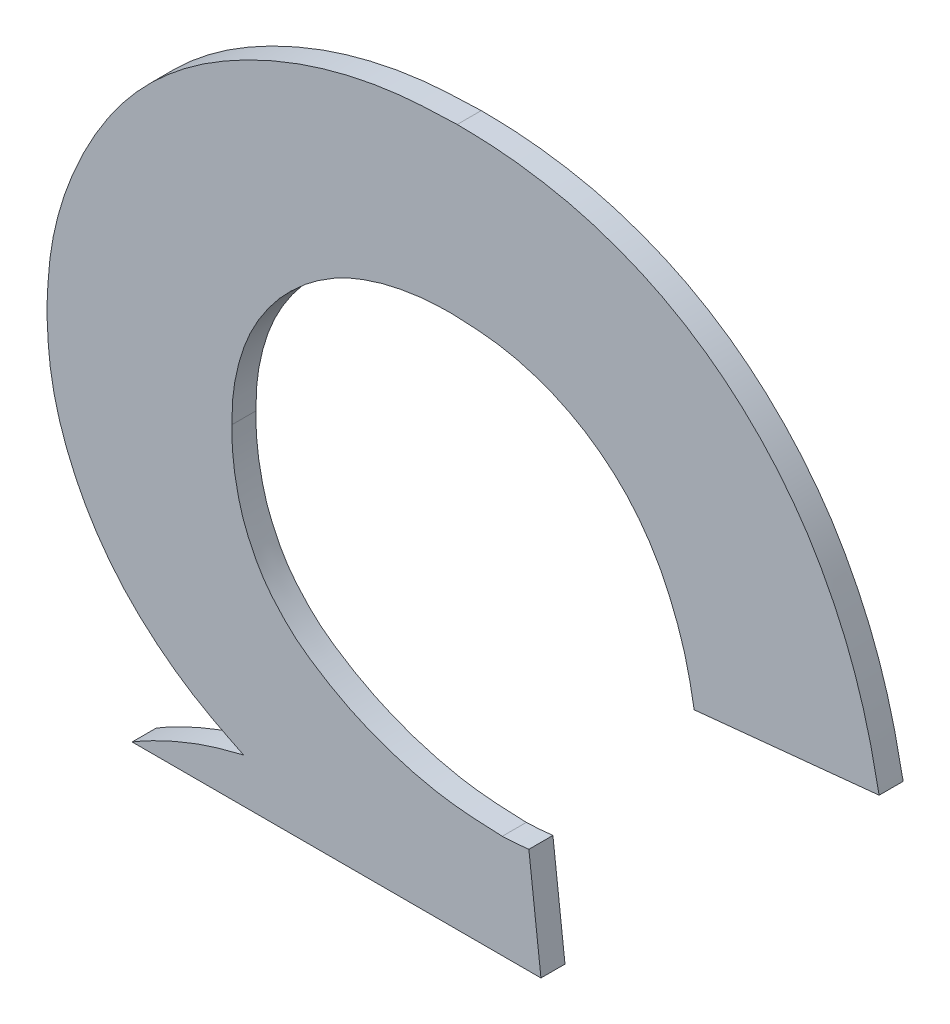
ISO-10303-21;
HEADER;
FILE_DESCRIPTION(('STEP AP214'),'2;1');
FILE_NAME('part.step','',(''),(''),'','','');
FILE_SCHEMA(('AUTOMOTIVE_DESIGN { 1 0 10303 214 1 1 1 1 }'));
ENDSEC;
DATA;
#1=APPLICATION_CONTEXT('core data for automotive mechanical design processes');
#2=APPLICATION_PROTOCOL_DEFINITION('international standard','automotive_design',2000,#1);
#3=PRODUCT_CONTEXT('',#1,'mechanical');
#4=PRODUCT('Part','Part','',(#3));
#5=PRODUCT_RELATED_PRODUCT_CATEGORY('part','',(#4));
#6=PRODUCT_DEFINITION_FORMATION('','',#4);
#7=PRODUCT_DEFINITION_CONTEXT('part definition',#1,'design');
#8=PRODUCT_DEFINITION('design','',#6,#7);
#9=PRODUCT_DEFINITION_SHAPE('','',#8);
#10=(LENGTH_UNIT() NAMED_UNIT(*) SI_UNIT(.MILLI.,.METRE.));
#11=(NAMED_UNIT(*) PLANE_ANGLE_UNIT() SI_UNIT($,.RADIAN.));
#12=(NAMED_UNIT(*) SI_UNIT($,.STERADIAN.) SOLID_ANGLE_UNIT());
#13=UNCERTAINTY_MEASURE_WITH_UNIT(LENGTH_MEASURE(1.E-05),#10,'distance_accuracy_value','');
#14=(GEOMETRIC_REPRESENTATION_CONTEXT(3) GLOBAL_UNCERTAINTY_ASSIGNED_CONTEXT((#13)) GLOBAL_UNIT_ASSIGNED_CONTEXT((#10,
#11,#12)) REPRESENTATION_CONTEXT('',''));
#15=CARTESIAN_POINT('',(0.,0.,0.));
#16=DIRECTION('',(0.,0.,1.));
#17=DIRECTION('',(1.,0.,0.));
#18=AXIS2_PLACEMENT_3D('',#15,#16,#17);
#19=CARTESIAN_POINT('',(2.34375000000002,-0.76923076923077,0.5));
#20=DIRECTION('',(-0.993499272973,-0.113838458361489,0.));
#21=DIRECTION('',(0.113838458361489,-0.993499272973,0.));
#22=AXIS2_PLACEMENT_3D('',#19,#20,#21);
#23=PLANE('',#22);
#24=DIRECTION('',(-0.113838458361489,0.993499272973,0.));
#25=VECTOR('',#24,1.);
#26=CARTESIAN_POINT('',(2.34375000000002,-0.76923076923077,0.5));
#27=LINE('',#26,#25);
#28=CARTESIAN_POINT('',(2.19831730769232,0.5,0.5));
#29=VERTEX_POINT('',#28);
#30=CARTESIAN_POINT('',(1.9471153846154,2.69230769230769,0.5));
#31=VERTEX_POINT('',#30);
#32=EDGE_CURVE('E335',#29,#31,#27,.T.);
#33=ORIENTED_EDGE('',*,*,#32,.F.);
#34=DIRECTION('',(0.,0.,-1.));
#35=VECTOR('',#34,1.);
#36=CARTESIAN_POINT('',(2.19831730769232,0.5,0.5));
#37=LINE('',#36,#35);
#38=CARTESIAN_POINT('',(2.19831730769232,0.5,0.));
#39=VERTEX_POINT('',#38);
#40=EDGE_CURVE('E53',#29,#39,#37,.T.);
#41=ORIENTED_EDGE('',*,*,#40,.T.);
#42=DIRECTION('',(-0.113838458361489,0.993499272973,0.));
#43=VECTOR('',#42,1.);
#44=CARTESIAN_POINT('',(2.34375000000002,-0.76923076923077,0.));
#45=LINE('',#44,#43);
#46=CARTESIAN_POINT('',(1.9471153846154,2.69230769230769,0.));
#47=VERTEX_POINT('',#46);
#48=EDGE_CURVE('E131',#39,#47,#45,.T.);
#49=ORIENTED_EDGE('',*,*,#48,.T.);
#50=DIRECTION('',(0.,0.,-1.));
#51=VECTOR('',#50,1.);
#52=CARTESIAN_POINT('',(1.9471153846154,2.69230769230769,0.5));
#53=LINE('',#52,#51);
#54=EDGE_CURVE('E260',#31,#47,#53,.T.);
#55=ORIENTED_EDGE('',*,*,#54,.F.);
#56=EDGE_LOOP('',(#33,#41,#49,#55));
#57=FACE_BOUND('',#56,.T.);
#58=ADVANCED_FACE('F39',(#57),#23,.F.);
#59=CARTESIAN_POINT('',(-3.98437499999998,1.42427884615384,0.5));
#60=CARTESIAN_POINT('',(-4.19980781435353,1.36988632262383,0.5));
#61=CARTESIAN_POINT('',(-4.62177781460573,1.26334724575874,0.5));
#62=CARTESIAN_POINT('',(-5.22782243598737,1.04260127920748,0.5));
#63=CARTESIAN_POINT('',(-5.79757241209382,0.784163298342848,0.5));
#64=CARTESIAN_POINT('',(-6.33861076027774,0.491451858864843,0.5));
#65=CARTESIAN_POINT('',(-6.83523011315003,0.145273143521969,0.5));
#66=CARTESIAN_POINT('',(-7.30454850547066,-0.233234039938428,0.5));
#67=CARTESIAN_POINT('',(-7.72882460582666,-0.662298857492223,0.5));
#68=CARTESIAN_POINT('',(-8.12035046471587,-1.1266286818268,0.5));
#69=CARTESIAN_POINT('',(-8.47659092188428,-1.6213642206543,0.5));
#70=CARTESIAN_POINT('',(-8.77637075945554,-2.15612918687906,0.5));
#71=CARTESIAN_POINT('',(-9.03507204743404,-2.71686556595007,0.5));
#72=CARTESIAN_POINT('',(-9.25566791173105,-3.30764034436966,0.5));
#73=CARTESIAN_POINT('',(-9.4141876024644,-3.93300884839882,0.5));
#74=CARTESIAN_POINT('',(-9.52753418707501,-4.58812633984064,0.5));
#75=CARTESIAN_POINT('',(-9.60233368970874,-5.27071672839264,0.5));
#76=CARTESIAN_POINT('',(-9.61099166837927,-5.73698113181403,0.5));
#77=CARTESIAN_POINT('',(-9.6153846153846,-5.97355769230769,0.5));
#78=B_SPLINE_CURVE_WITH_KNOTS('',3,(#59,#60,#61,#62,#63,#64,#65,#66,#67,#68,#69,#70,#71,#72,#73,
#74,#75,#76,#77),.UNSPECIFIED.,.F.,.F.,(4,1,1,1,1,1,1,1,1,1,1,1,1,1,1,1,4),(0.,
0.0658282446781898,0.128938316601441,0.190858323719115,0.251186231045244,0.310974017780072,
0.370049878512695,0.42967230953493,0.489507256826674,0.549975271732241,0.610074807611578,
0.670914865342259,0.732908854389039,0.796710708821786,0.861825383602173,0.92989197705194,1.),.UNSPECIFIED.);
#79=DIRECTION('',(0.,0.,-1.));
#80=VECTOR('',#79,1.);
#81=SURFACE_OF_LINEAR_EXTRUSION('',#78,#80);
#82=CARTESIAN_POINT('',(-3.98437499999998,1.42427884615384,0.));
#83=CARTESIAN_POINT('',(-4.19980781435353,1.36988632262383,0.));
#84=CARTESIAN_POINT('',(-4.62177781460573,1.26334724575874,0.));
#85=CARTESIAN_POINT('',(-5.22782243598737,1.04260127920748,0.));
#86=CARTESIAN_POINT('',(-5.79757241209382,0.784163298342848,0.));
#87=CARTESIAN_POINT('',(-6.33861076027774,0.491451858864843,0.));
#88=CARTESIAN_POINT('',(-6.83523011315003,0.145273143521969,0.));
#89=CARTESIAN_POINT('',(-7.30454850547066,-0.233234039938428,0.));
#90=CARTESIAN_POINT('',(-7.72882460582666,-0.662298857492223,0.));
#91=CARTESIAN_POINT('',(-8.12035046471587,-1.1266286818268,0.));
#92=CARTESIAN_POINT('',(-8.47659092188428,-1.6213642206543,0.));
#93=CARTESIAN_POINT('',(-8.77637075945554,-2.15612918687906,0.));
#94=CARTESIAN_POINT('',(-9.03507204743404,-2.71686556595007,0.));
#95=CARTESIAN_POINT('',(-9.25566791173105,-3.30764034436966,0.));
#96=CARTESIAN_POINT('',(-9.4141876024644,-3.93300884839882,0.));
#97=CARTESIAN_POINT('',(-9.52753418707501,-4.58812633984064,0.));
#98=CARTESIAN_POINT('',(-9.60233368970874,-5.27071672839264,0.));
#99=CARTESIAN_POINT('',(-9.61099166837927,-5.73698113181403,0.));
#100=CARTESIAN_POINT('',(-9.6153846153846,-5.97355769230769,0.));
#101=B_SPLINE_CURVE_WITH_KNOTS('',3,(#82,#83,#84,#85,#86,#87,#88,#89,#90,#91,#92,#93,#94,#95,
#96,#97,#98,#99,#100),.UNSPECIFIED.,.F.,.F.,(4,1,1,1,1,1,1,1,1,1,1,1,1,1,1,1,4),(0.,
0.0658282446781898,0.128938316601441,0.190858323719115,0.251186231045244,0.310974017780072,
0.370049878512695,0.42967230953493,0.489507256826674,0.549975271732241,0.610074807611578,
0.670914865342259,0.732908854389039,0.796710708821786,0.861825383602173,0.92989197705194,1.),.UNSPECIFIED.);
#102=CARTESIAN_POINT('',(-3.98437499999999,1.42427884615384,0.));
#103=VERTEX_POINT('',#102);
#104=CARTESIAN_POINT('',(-6.30271128193493,0.500000000000003,0.));
#105=VERTEX_POINT('',#104);
#106=EDGE_CURVE('E125',#103,#105,#101,.T.);
#107=ORIENTED_EDGE('',*,*,#106,.T.);
#108=DIRECTION('',(0.,0.,-1.));
#109=VECTOR('',#108,1.);
#110=CARTESIAN_POINT('',(-6.3027112837536,0.500000000000006,0.5));
#111=LINE('',#110,#109);
#112=CARTESIAN_POINT('',(-6.30271127647894,0.5,0.5));
#113=VERTEX_POINT('',#112);
#114=EDGE_CURVE('E113',#105,#113,#111,.F.);
#115=ORIENTED_EDGE('',*,*,#114,.T.);
#116=CARTESIAN_POINT('',(-3.98437499999999,1.42427884615384,0.5));
#117=VERTEX_POINT('',#116);
#118=EDGE_CURVE('E137',#117,#113,#78,.T.);
#119=ORIENTED_EDGE('',*,*,#118,.F.);
#120=DIRECTION('',(0.,0.,-1.));
#121=VECTOR('',#120,1.);
#122=CARTESIAN_POINT('',(-3.98437499999999,1.42427884615384,0.5));
#123=LINE('',#122,#121);
#124=EDGE_CURVE('E121',#117,#103,#123,.T.);
#125=ORIENTED_EDGE('',*,*,#124,.T.);
#126=EDGE_LOOP('',(#107,#115,#119,#125));
#127=FACE_BOUND('',#126,.T.);
#128=ADVANCED_FACE('F133',(#127),#81,.F.);
#129=CARTESIAN_POINT('',(6.6712729927265,-13.0558506104563,0.5));
#130=DIRECTION('',(0.,0.,-1.));
#131=DIRECTION('',(-1.,0.,0.));
#132=AXIS2_PLACEMENT_3D('',#129,#130,#131);
#133=PLANE('',#132);
#134=ORIENTED_EDGE('',*,*,#118,.T.);
#135=DIRECTION('',(1.,0.,0.));
#136=VECTOR('',#135,1.);
#137=CARTESIAN_POINT('',(6.6712729927265,0.5,0.5));
#138=LINE('',#137,#136);
#139=EDGE_CURVE('E120',#113,#29,#138,.T.);
#140=ORIENTED_EDGE('',*,*,#139,.T.);
#141=ORIENTED_EDGE('',*,*,#32,.T.);
#142=CARTESIAN_POINT('',(1.9471153846154,2.69230769230769,0.5));
#143=CARTESIAN_POINT('',(1.8430477377101,2.68093594163545,0.5));
#144=CARTESIAN_POINT('',(1.65919602781834,2.6608459725843,0.5));
#145=CARTESIAN_POINT('',(1.47441717432133,2.65344995245697,0.5));
#146=CARTESIAN_POINT('',(1.39423076923078,2.65024038461538,0.5));
#147=B_SPLINE_CURVE_WITH_KNOTS('',3,(#142,#143,#144,#145,#146),.UNSPECIFIED.,.F.,.F.,(4,1,4),
(0.,0.566041224020037,1.),.UNSPECIFIED.);
#148=CARTESIAN_POINT('',(1.39423076923078,2.65024038461538,0.5));
#149=VERTEX_POINT('',#148);
#150=EDGE_CURVE('E234',#31,#149,#147,.T.);
#151=ORIENTED_EDGE('',*,*,#150,.T.);
#152=CARTESIAN_POINT('',(1.39423076923078,2.65024038461538,0.5));
#153=CARTESIAN_POINT('',(1.04051198277855,2.66374523154057,0.5));
#154=CARTESIAN_POINT('',(0.346626907498309,2.69023749625548,0.5));
#155=CARTESIAN_POINT('',(-0.664923019283656,2.91036602840606,0.5));
#156=CARTESIAN_POINT('',(-1.62357567218962,3.25695129504603,0.5));
#157=CARTESIAN_POINT('',(-2.36419677269751,3.67047780300976,0.5));
#158=CARTESIAN_POINT('',(-2.91341635642348,4.05942194380833,0.5));
#159=CARTESIAN_POINT('',(-3.25974318354604,4.41011025876403,0.5));
#160=CARTESIAN_POINT('',(-3.57197468340025,4.7822614051555,0.5));
#161=CARTESIAN_POINT('',(-3.80492490181777,5.2091322486373,0.5));
#162=CARTESIAN_POINT('',(-4.00617951851744,5.6626928276327,0.5));
#163=CARTESIAN_POINT('',(-4.13080598641055,6.16081010329336,0.5));
#164=CARTESIAN_POINT('',(-4.22169379763049,6.69137613344254,0.5));
#165=CARTESIAN_POINT('',(-4.22768977117626,7.05886058040911,0.5));
#166=CARTESIAN_POINT('',(-4.23076923076921,7.24759615384615,0.5));
#167=B_SPLINE_CURVE_WITH_KNOTS('',3,(#152,#153,#154,#155,#156,#157,#158,#159,#160,#161,#162,
#163,#164,#165,#166),.UNSPECIFIED.,.F.,.F.,(4,1,1,1,1,1,1,1,1,1,1,1,4),(0.,0.129789075657632,
0.25460537009224,0.378435492481737,0.502919582675044,0.56501796697597,0.624847774630795,
0.683448087190674,0.74276451975577,0.802756957812947,0.865220374248951,0.930778812100126,1.),.UNSPECIFIED.);
#168=CARTESIAN_POINT('',(-4.23076923076921,7.24759615384615,0.5));
#169=VERTEX_POINT('',#168);
#170=EDGE_CURVE('E230',#149,#169,#167,.T.);
#171=ORIENTED_EDGE('',*,*,#170,.T.);
#172=CARTESIAN_POINT('',(-4.23076923076921,7.24759615384615,0.5));
#173=CARTESIAN_POINT('',(-4.22792711518039,7.40004424009474,0.5));
#174=CARTESIAN_POINT('',(-4.22236873883271,7.69818969209017,0.5));
#175=CARTESIAN_POINT('',(-4.16044592639652,8.13530240363856,0.5));
#176=CARTESIAN_POINT('',(-4.05803319884192,8.54948015916899,0.5));
#177=CARTESIAN_POINT('',(-3.91961221111562,8.94514523872855,0.5));
#178=CARTESIAN_POINT('',(-3.73819775873826,9.3202240205715,0.5));
#179=CARTESIAN_POINT('',(-3.51322959963469,9.67425733540094,0.5));
#180=CARTESIAN_POINT('',(-3.25619584096005,10.014427031895,0.5));
#181=CARTESIAN_POINT('',(-2.9527765864727,10.3231553655619,0.5));
#182=CARTESIAN_POINT('',(-2.62784089009125,10.6130054225936,0.5));
#183=CARTESIAN_POINT('',(-2.26953967652406,10.8571186146477,0.5));
#184=CARTESIAN_POINT('',(-1.89492541735422,11.0739773001811,0.5));
#185=CARTESIAN_POINT('',(-1.49078630367999,11.2378472872967,0.5));
#186=CARTESIAN_POINT('',(-1.06709959220831,11.3725751341235,0.5));
#187=CARTESIAN_POINT('',(-0.620243546719225,11.4669869527826,0.5));
#188=CARTESIAN_POINT('',(-0.150055070650286,11.5303908192876,0.5));
#189=CARTESIAN_POINT('',(0.172057838686011,11.535733436198,0.5));
#190=CARTESIAN_POINT('',(0.336538461538478,11.5384615384615,0.5));
#191=B_SPLINE_CURVE_WITH_KNOTS('',3,(#172,#173,#174,#175,#176,#177,#178,#179,#180,#181,#182,
#183,#184,#185,#186,#187,#188,#189,#190),.UNSPECIFIED.,.F.,.F.,(4,1,1,1,1,1,1,1,1,1,1,1,1,1,1,1,
4),(0.,0.0650933507070889,0.127304231532406,0.188122021580146,0.247130516100763,
0.306076916008242,0.365678227365853,0.426103348162581,0.487841495079736,0.550316716799864,
0.611805223513785,0.672737315854453,0.734883408999324,0.797680202933679,0.862474687108868,
0.929775403385968,1.),.UNSPECIFIED.);
#192=CARTESIAN_POINT('',(0.336538461538478,11.5384615384615,0.5));
#193=VERTEX_POINT('',#192);
#194=EDGE_CURVE('E219',#169,#193,#191,.T.);
#195=ORIENTED_EDGE('',*,*,#194,.T.);
#196=CARTESIAN_POINT('',(0.336538461538478,11.5384615384615,0.5));
#197=CARTESIAN_POINT('',(0.65842288639152,11.5259107339492,0.5));
#198=CARTESIAN_POINT('',(1.28002941563206,11.5016732703452,0.5));
#199=CARTESIAN_POINT('',(2.16999328710879,11.2774264559635,0.5));
#200=CARTESIAN_POINT('',(2.97646123893481,10.9145659307273,0.5));
#201=CARTESIAN_POINT('',(3.57353122912369,10.4890318354276,0.5));
#202=CARTESIAN_POINT('',(3.99750342370869,10.0821971694539,0.5));
#203=CARTESIAN_POINT('',(4.28709889021856,9.73735787507504,0.5));
#204=CARTESIAN_POINT('',(4.54612562358113,9.35655472826317,0.5));
#205=CARTESIAN_POINT('',(4.77531775332889,8.93992346517837,0.5));
#206=CARTESIAN_POINT('',(4.97157883134913,8.48578854710865,0.5));
#207=CARTESIAN_POINT('',(5.14850274213119,7.99977602972343,0.5));
#208=CARTESIAN_POINT('',(5.28545826425501,7.47410484921689,0.5));
#209=CARTESIAN_POINT('',(5.35100271288855,7.10986654268623,0.5));
#210=CARTESIAN_POINT('',(5.3846153846154,6.92307692307692,0.5));
#211=B_SPLINE_CURVE_WITH_KNOTS('',3,(#196,#197,#198,#199,#200,#201,#202,#203,#204,#205,#206,
#207,#208,#209,#210),.UNSPECIFIED.,.F.,.F.,(4,1,1,1,1,1,1,1,1,1,1,1,4),(0.,0.127797158234837,
0.246795252716655,0.362284315583916,0.477652464727305,0.536236841728714,0.595590435516285,
0.656343759139638,0.719085140507875,0.784349165128122,0.852875534636558,0.9245512555167,1.),.UNSPECIFIED.);
#212=CARTESIAN_POINT('',(5.3846153846154,6.92307692307692,0.5));
#213=VERTEX_POINT('',#212);
#214=EDGE_CURVE('E214',#193,#213,#211,.T.);
#215=ORIENTED_EDGE('',*,*,#214,.T.);
#216=DIRECTION('',(0.995037190209989,0.0995037190209984,0.));
#217=VECTOR('',#216,1.);
#218=CARTESIAN_POINT('',(5.3846153846154,6.92307692307692,0.5));
#219=LINE('',#218,#217);
#220=CARTESIAN_POINT('',(9.23076923076925,7.3076923076923,0.5));
#221=VERTEX_POINT('',#220);
#222=EDGE_CURVE('E193',#213,#221,#219,.T.);
#223=ORIENTED_EDGE('',*,*,#222,.T.);
#224=CARTESIAN_POINT('',(9.23076923076925,7.30769230769231,0.5));
#225=CARTESIAN_POINT('',(9.17060390394492,7.60508110779343,0.5));
#226=CARTESIAN_POINT('',(9.05258487913404,8.1884326497885,0.5));
#227=CARTESIAN_POINT('',(8.81214169273535,9.03095123776347,0.5));
#228=CARTESIAN_POINT('',(8.51892419885517,9.82183626672846,0.5));
#229=CARTESIAN_POINT('',(8.16686732298136,10.5574617001587,0.5));
#230=CARTESIAN_POINT('',(7.77260335884164,11.2466312200201,0.5));
#231=CARTESIAN_POINT('',(7.31779127133717,11.8811702150398,0.5));
#232=CARTESIAN_POINT('',(6.81309413238368,12.4648511094876,0.5));
#233=CARTESIAN_POINT('',(6.25761547732378,12.9958935822109,0.5));
#234=CARTESIAN_POINT('',(5.65889624911758,13.4701739091517,0.5));
#235=CARTESIAN_POINT('',(5.01995203343288,13.8793029209004,0.5));
#236=CARTESIAN_POINT('',(4.34602640827222,14.2260987162882,0.5));
#237=CARTESIAN_POINT('',(3.63648840845306,14.5056774859437,0.5));
#238=CARTESIAN_POINT('',(2.891899814035,14.7330173868139,0.5));
#239=CARTESIAN_POINT('',(2.11014230821179,14.8836306346324,0.5));
#240=CARTESIAN_POINT('',(1.29475440091938,14.9855129059538,0.5));
#241=CARTESIAN_POINT('',(0.739508465370112,14.9951115613889,0.5));
#242=CARTESIAN_POINT('',(0.456730769230786,15.,0.5));
#243=B_SPLINE_CURVE_WITH_KNOTS('',3,(#224,#225,#226,#227,#228,#229,#230,#231,#232,#233,#234,
#235,#236,#237,#238,#239,#240,#241,#242),.UNSPECIFIED.,.F.,.F.,(4,1,1,1,1,1,1,1,1,1,1,1,1,1,1,1,
4),(0.,0.0710363230120582,0.139343339603417,0.204958472702596,0.268331583077049,
0.330129260966997,0.390663976480565,0.45086144861515,0.510587265834356,0.570373853961698,
0.629455009154736,0.687993523080573,0.747580994103784,0.807838761476966,0.8700340388224,
0.933810456366549,1.),.UNSPECIFIED.);
#244=CARTESIAN_POINT('',(0.456730769230786,15.,0.5));
#245=VERTEX_POINT('',#244);
#246=EDGE_CURVE('E190',#221,#245,#243,.T.);
#247=ORIENTED_EDGE('',*,*,#246,.T.);
#248=CARTESIAN_POINT('',(0.456730769230786,15.,0.5));
#249=CARTESIAN_POINT('',(0.0652991217447992,14.9873068343528,0.5));
#250=CARTESIAN_POINT('',(-0.704382050516485,14.9623479668781,0.5));
#251=CARTESIAN_POINT('',(-1.83486432712289,14.7641216352343,0.5));
#252=CARTESIAN_POINT('',(-2.91616467255313,14.4388282642541,0.5));
#253=CARTESIAN_POINT('',(-3.93958194344684,13.9879136479276,0.5));
#254=CARTESIAN_POINT('',(-4.88750877009524,13.4369078812222,0.5));
#255=CARTESIAN_POINT('',(-5.72634588083091,12.77656102662,0.5));
#256=CARTESIAN_POINT('',(-6.44487915605259,12.0182969447364,0.5));
#257=CARTESIAN_POINT('',(-7.02915268122327,11.1704056505233,0.5));
#258=CARTESIAN_POINT('',(-7.49181535013606,10.2676548040226,0.5));
#259=CARTESIAN_POINT('',(-7.83417181708601,9.33056026865677,0.5));
#260=CARTESIAN_POINT('',(-8.03873494443531,8.36020079400887,0.5));
#261=CARTESIAN_POINT('',(-8.0641678113881,7.70326767287341,0.5));
#262=CARTESIAN_POINT('',(-8.07692307692306,7.37379807692307,0.5));
#263=B_SPLINE_CURVE_WITH_KNOTS('',3,(#248,#249,#250,#251,#252,#253,#254,#255,#256,#257,#258,
#259,#260,#261,#262),.UNSPECIFIED.,.F.,.F.,(4,1,1,1,1,1,1,1,1,1,1,1,4),(0.,0.0920539892768583,
0.1810079047849,0.269130075987509,0.357137472706874,0.44354901358482,0.526433445631973,
0.607452935758997,0.688384638514421,0.767853849931855,0.845530589760062,0.922529443955459,1.),.UNSPECIFIED.);
#264=CARTESIAN_POINT('',(-8.07692307692306,7.37379807692307,0.5));
#265=VERTEX_POINT('',#264);
#266=EDGE_CURVE('E176',#245,#265,#263,.T.);
#267=ORIENTED_EDGE('',*,*,#266,.T.);
#268=CARTESIAN_POINT('',(-8.07692307692306,7.37379807692308,0.5));
#269=CARTESIAN_POINT('',(-8.06399178775001,7.06235147822528,0.5));
#270=CARTESIAN_POINT('',(-8.03845957690403,6.44741509262607,0.5));
#271=CARTESIAN_POINT('',(-7.84189171335712,5.5482691626722,0.5));
#272=CARTESIAN_POINT('',(-7.50973113001491,4.69642950232083,0.5));
#273=CARTESIAN_POINT('',(-7.06077473966609,3.88890738470635,0.5));
#274=CARTESIAN_POINT('',(-6.47858845609637,3.14316614005985,0.5));
#275=CARTESIAN_POINT('',(-5.76477136778225,2.4786427168752,0.5));
#276=CARTESIAN_POINT('',(-4.93074267826013,1.88897862676894,0.5));
#277=CARTESIAN_POINT('',(-4.30570871281085,1.58206498919073,0.5));
#278=CARTESIAN_POINT('',(-3.98437499999999,1.42427884615384,0.5));
#279=B_SPLINE_CURVE_WITH_KNOTS('',3,(#268,#269,#270,#271,#272,#273,#274,#275,#276,#277,#278),
.UNSPECIFIED.,.F.,.F.,(4,1,1,1,1,1,1,1,4),(0.,0.121951202249343,0.240786805327923,
0.358549872370745,0.479065841400276,0.601518544773534,0.727550518930898,0.859932086662844,1.),.UNSPECIFIED.);
#280=EDGE_CURVE('E169',#265,#117,#279,.T.);
#281=ORIENTED_EDGE('',*,*,#280,.T.);
#282=EDGE_LOOP('',(#134,#140,#141,#151,#171,#195,#215,#223,#247,#267,#281));
#283=FACE_BOUND('',#282,.T.);
#284=ADVANCED_FACE('F154',(#283),#133,.F.);
#285=DIRECTION('',(0.,0.,-1.));
#286=VECTOR('',#285,1.);
#287=SURFACE_OF_LINEAR_EXTRUSION('',#147,#286);
#288=CARTESIAN_POINT('',(1.9471153846154,2.69230769230769,0.));
#289=CARTESIAN_POINT('',(1.8430477377101,2.68093594163545,0.));
#290=CARTESIAN_POINT('',(1.65919602781834,2.6608459725843,0.));
#291=CARTESIAN_POINT('',(1.47441717432133,2.65344995245697,0.));
#292=CARTESIAN_POINT('',(1.39423076923078,2.65024038461538,0.));
#293=B_SPLINE_CURVE_WITH_KNOTS('',3,(#288,#289,#290,#291,#292),.UNSPECIFIED.,.F.,.F.,(4,1,4),
(0.,0.566041224020037,1.),.UNSPECIFIED.);
#294=CARTESIAN_POINT('',(1.39423076923078,2.65024038461538,0.));
#295=VERTEX_POINT('',#294);
#296=EDGE_CURVE('E172',#47,#295,#293,.T.);
#297=ORIENTED_EDGE('',*,*,#296,.T.);
#298=DIRECTION('',(0.,0.,-1.));
#299=VECTOR('',#298,1.);
#300=CARTESIAN_POINT('',(1.39423076923078,2.65024038461538,0.5));
#301=LINE('',#300,#299);
#302=EDGE_CURVE('E258',#149,#295,#301,.T.);
#303=ORIENTED_EDGE('',*,*,#302,.F.);
#304=ORIENTED_EDGE('',*,*,#150,.F.);
#305=ORIENTED_EDGE('',*,*,#54,.T.);
#306=EDGE_LOOP('',(#297,#303,#304,#305));
#307=FACE_BOUND('',#306,.T.);
#308=ADVANCED_FACE('F153',(#307),#287,.F.);
#309=DIRECTION('',(0.,0.,-1.));
#310=VECTOR('',#309,1.);
#311=SURFACE_OF_LINEAR_EXTRUSION('',#167,#310);
#312=CARTESIAN_POINT('',(1.39423076923078,2.65024038461538,0.));
#313=CARTESIAN_POINT('',(1.04051198277855,2.66374523154057,0.));
#314=CARTESIAN_POINT('',(0.346626907498309,2.69023749625548,0.));
#315=CARTESIAN_POINT('',(-0.664923019283656,2.91036602840606,0.));
#316=CARTESIAN_POINT('',(-1.62357567218962,3.25695129504603,0.));
#317=CARTESIAN_POINT('',(-2.36419677269751,3.67047780300976,0.));
#318=CARTESIAN_POINT('',(-2.91341635642348,4.05942194380833,0.));
#319=CARTESIAN_POINT('',(-3.25974318354604,4.41011025876403,0.));
#320=CARTESIAN_POINT('',(-3.57197468340025,4.7822614051555,0.));
#321=CARTESIAN_POINT('',(-3.80492490181777,5.2091322486373,0.));
#322=CARTESIAN_POINT('',(-4.00617951851744,5.6626928276327,0.));
#323=CARTESIAN_POINT('',(-4.13080598641055,6.16081010329336,0.));
#324=CARTESIAN_POINT('',(-4.22169379763049,6.69137613344254,0.));
#325=CARTESIAN_POINT('',(-4.22768977117626,7.05886058040911,0.));
#326=CARTESIAN_POINT('',(-4.23076923076921,7.24759615384615,0.));
#327=B_SPLINE_CURVE_WITH_KNOTS('',3,(#312,#313,#314,#315,#316,#317,#318,#319,#320,#321,#322,
#323,#324,#325,#326),.UNSPECIFIED.,.F.,.F.,(4,1,1,1,1,1,1,1,1,1,1,1,4),(0.,0.129789075657632,
0.25460537009224,0.378435492481737,0.502919582675044,0.56501796697597,0.624847774630795,
0.683448087190674,0.74276451975577,0.802756957812947,0.865220374248951,0.930778812100126,1.),.UNSPECIFIED.);
#328=CARTESIAN_POINT('',(-4.23076923076921,7.24759615384615,0.));
#329=VERTEX_POINT('',#328);
#330=EDGE_CURVE('E265',#295,#329,#327,.T.);
#331=ORIENTED_EDGE('',*,*,#330,.T.);
#332=DIRECTION('',(0.,0.,-1.));
#333=VECTOR('',#332,1.);
#334=CARTESIAN_POINT('',(-4.23076923076921,7.24759615384615,0.5));
#335=LINE('',#334,#333);
#336=EDGE_CURVE('E277',#169,#329,#335,.T.);
#337=ORIENTED_EDGE('',*,*,#336,.F.);
#338=ORIENTED_EDGE('',*,*,#170,.F.);
#339=ORIENTED_EDGE('',*,*,#302,.T.);
#340=EDGE_LOOP('',(#331,#337,#338,#339));
#341=FACE_BOUND('',#340,.T.);
#342=ADVANCED_FACE('F245',(#341),#311,.F.);
#343=DIRECTION('',(0.,0.,-1.));
#344=VECTOR('',#343,1.);
#345=SURFACE_OF_LINEAR_EXTRUSION('',#191,#344);
#346=CARTESIAN_POINT('',(-4.23076923076921,7.24759615384615,0.));
#347=CARTESIAN_POINT('',(-4.22792711518039,7.40004424009474,0.));
#348=CARTESIAN_POINT('',(-4.22236873883271,7.69818969209017,0.));
#349=CARTESIAN_POINT('',(-4.16044592639652,8.13530240363856,0.));
#350=CARTESIAN_POINT('',(-4.05803319884192,8.54948015916899,0.));
#351=CARTESIAN_POINT('',(-3.91961221111562,8.94514523872855,0.));
#352=CARTESIAN_POINT('',(-3.73819775873826,9.3202240205715,0.));
#353=CARTESIAN_POINT('',(-3.51322959963469,9.67425733540094,0.));
#354=CARTESIAN_POINT('',(-3.25619584096005,10.014427031895,0.));
#355=CARTESIAN_POINT('',(-2.9527765864727,10.3231553655619,0.));
#356=CARTESIAN_POINT('',(-2.62784089009125,10.6130054225936,0.));
#357=CARTESIAN_POINT('',(-2.26953967652406,10.8571186146477,0.));
#358=CARTESIAN_POINT('',(-1.89492541735422,11.0739773001811,0.));
#359=CARTESIAN_POINT('',(-1.49078630367999,11.2378472872967,0.));
#360=CARTESIAN_POINT('',(-1.06709959220831,11.3725751341235,0.));
#361=CARTESIAN_POINT('',(-0.620243546719225,11.4669869527826,0.));
#362=CARTESIAN_POINT('',(-0.150055070650286,11.5303908192876,0.));
#363=CARTESIAN_POINT('',(0.172057838686011,11.535733436198,0.));
#364=CARTESIAN_POINT('',(0.336538461538478,11.5384615384615,0.));
#365=B_SPLINE_CURVE_WITH_KNOTS('',3,(#346,#347,#348,#349,#350,#351,#352,#353,#354,#355,#356,
#357,#358,#359,#360,#361,#362,#363,#364),.UNSPECIFIED.,.F.,.F.,(4,1,1,1,1,1,1,1,1,1,1,1,1,1,1,1,
4),(0.,0.0650933507070889,0.127304231532406,0.188122021580146,0.247130516100763,
0.306076916008242,0.365678227365853,0.426103348162581,0.487841495079736,0.550316716799864,
0.611805223513785,0.672737315854453,0.734883408999324,0.797680202933679,0.862474687108868,
0.929775403385968,1.),.UNSPECIFIED.);
#366=CARTESIAN_POINT('',(0.336538461538478,11.5384615384615,0.));
#367=VERTEX_POINT('',#366);
#368=EDGE_CURVE('E264',#329,#367,#365,.T.);
#369=ORIENTED_EDGE('',*,*,#368,.T.);
#370=DIRECTION('',(0.,0.,-1.));
#371=VECTOR('',#370,1.);
#372=CARTESIAN_POINT('',(0.336538461538478,11.5384615384615,0.5));
#373=LINE('',#372,#371);
#374=EDGE_CURVE('E287',#193,#367,#373,.T.);
#375=ORIENTED_EDGE('',*,*,#374,.F.);
#376=ORIENTED_EDGE('',*,*,#194,.F.);
#377=ORIENTED_EDGE('',*,*,#336,.T.);
#378=EDGE_LOOP('',(#369,#375,#376,#377));
#379=FACE_BOUND('',#378,.T.);
#380=ADVANCED_FACE('F213',(#379),#345,.F.);
#381=DIRECTION('',(0.,0.,-1.));
#382=VECTOR('',#381,1.);
#383=SURFACE_OF_LINEAR_EXTRUSION('',#211,#382);
#384=CARTESIAN_POINT('',(0.336538461538478,11.5384615384615,0.));
#385=CARTESIAN_POINT('',(0.65842288639152,11.5259107339492,0.));
#386=CARTESIAN_POINT('',(1.28002941563206,11.5016732703452,0.));
#387=CARTESIAN_POINT('',(2.16999328710879,11.2774264559635,0.));
#388=CARTESIAN_POINT('',(2.97646123893481,10.9145659307273,0.));
#389=CARTESIAN_POINT('',(3.57353122912369,10.4890318354276,0.));
#390=CARTESIAN_POINT('',(3.99750342370869,10.0821971694539,0.));
#391=CARTESIAN_POINT('',(4.28709889021856,9.73735787507504,0.));
#392=CARTESIAN_POINT('',(4.54612562358113,9.35655472826317,0.));
#393=CARTESIAN_POINT('',(4.77531775332889,8.93992346517837,0.));
#394=CARTESIAN_POINT('',(4.97157883134913,8.48578854710865,0.));
#395=CARTESIAN_POINT('',(5.14850274213119,7.99977602972343,0.));
#396=CARTESIAN_POINT('',(5.28545826425501,7.47410484921689,0.));
#397=CARTESIAN_POINT('',(5.35100271288855,7.10986654268623,0.));
#398=CARTESIAN_POINT('',(5.3846153846154,6.92307692307692,0.));
#399=B_SPLINE_CURVE_WITH_KNOTS('',3,(#384,#385,#386,#387,#388,#389,#390,#391,#392,#393,#394,
#395,#396,#397,#398),.UNSPECIFIED.,.F.,.F.,(4,1,1,1,1,1,1,1,1,1,1,1,4),(0.,0.127797158234837,
0.246795252716655,0.362284315583916,0.477652464727305,0.536236841728714,0.595590435516285,
0.656343759139638,0.719085140507875,0.784349165128122,0.852875534636558,0.9245512555167,1.),.UNSPECIFIED.);
#400=CARTESIAN_POINT('',(5.3846153846154,6.92307692307692,0.));
#401=VERTEX_POINT('',#400);
#402=EDGE_CURVE('E278',#367,#401,#399,.T.);
#403=ORIENTED_EDGE('',*,*,#402,.T.);
#404=DIRECTION('',(0.,0.,-1.));
#405=VECTOR('',#404,1.);
#406=CARTESIAN_POINT('',(5.3846153846154,6.92307692307692,0.5));
#407=LINE('',#406,#405);
#408=EDGE_CURVE('E295',#213,#401,#407,.T.);
#409=ORIENTED_EDGE('',*,*,#408,.F.);
#410=ORIENTED_EDGE('',*,*,#214,.F.);
#411=ORIENTED_EDGE('',*,*,#374,.T.);
#412=EDGE_LOOP('',(#403,#409,#410,#411));
#413=FACE_BOUND('',#412,.T.);
#414=ADVANCED_FACE('F209',(#413),#383,.F.);
#415=CARTESIAN_POINT('',(5.3846153846154,6.92307692307692,0.5));
#416=DIRECTION('',(-0.0995037190209984,0.995037190209989,0.));
#417=DIRECTION('',(-0.995037190209989,-0.0995037190209984,0.));
#418=AXIS2_PLACEMENT_3D('',#415,#416,#417);
#419=PLANE('',#418);
#420=DIRECTION('',(0.995037190209989,0.0995037190209984,0.));
#421=VECTOR('',#420,1.);
#422=CARTESIAN_POINT('',(5.3846153846154,6.92307692307692,0.));
#423=LINE('',#422,#421);
#424=CARTESIAN_POINT('',(9.23076923076925,7.3076923076923,0.));
#425=VERTEX_POINT('',#424);
#426=EDGE_CURVE('E289',#401,#425,#423,.T.);
#427=ORIENTED_EDGE('',*,*,#426,.T.);
#428=DIRECTION('',(0.,0.,-1.));
#429=VECTOR('',#428,1.);
#430=CARTESIAN_POINT('',(9.23076923076925,7.3076923076923,0.5));
#431=LINE('',#430,#429);
#432=EDGE_CURVE('E299',#221,#425,#431,.T.);
#433=ORIENTED_EDGE('',*,*,#432,.F.);
#434=ORIENTED_EDGE('',*,*,#222,.F.);
#435=ORIENTED_EDGE('',*,*,#408,.T.);
#436=EDGE_LOOP('',(#427,#433,#434,#435));
#437=FACE_BOUND('',#436,.T.);
#438=ADVANCED_FACE('F201',(#437),#419,.F.);
#439=DIRECTION('',(0.,0.,-1.));
#440=VECTOR('',#439,1.);
#441=SURFACE_OF_LINEAR_EXTRUSION('',#243,#440);
#442=CARTESIAN_POINT('',(9.23076923076925,7.30769230769231,0.));
#443=CARTESIAN_POINT('',(9.17060390394492,7.60508110779343,0.));
#444=CARTESIAN_POINT('',(9.05258487913404,8.1884326497885,0.));
#445=CARTESIAN_POINT('',(8.81214169273535,9.03095123776347,0.));
#446=CARTESIAN_POINT('',(8.51892419885517,9.82183626672846,0.));
#447=CARTESIAN_POINT('',(8.16686732298136,10.5574617001587,0.));
#448=CARTESIAN_POINT('',(7.77260335884164,11.2466312200201,0.));
#449=CARTESIAN_POINT('',(7.31779127133717,11.8811702150398,0.));
#450=CARTESIAN_POINT('',(6.81309413238368,12.4648511094876,0.));
#451=CARTESIAN_POINT('',(6.25761547732378,12.9958935822109,0.));
#452=CARTESIAN_POINT('',(5.65889624911758,13.4701739091517,0.));
#453=CARTESIAN_POINT('',(5.01995203343288,13.8793029209004,0.));
#454=CARTESIAN_POINT('',(4.34602640827222,14.2260987162882,0.));
#455=CARTESIAN_POINT('',(3.63648840845306,14.5056774859437,0.));
#456=CARTESIAN_POINT('',(2.891899814035,14.7330173868139,0.));
#457=CARTESIAN_POINT('',(2.11014230821179,14.8836306346324,0.));
#458=CARTESIAN_POINT('',(1.29475440091938,14.9855129059538,0.));
#459=CARTESIAN_POINT('',(0.739508465370112,14.9951115613889,0.));
#460=CARTESIAN_POINT('',(0.456730769230786,15.,0.));
#461=B_SPLINE_CURVE_WITH_KNOTS('',3,(#442,#443,#444,#445,#446,#447,#448,#449,#450,#451,#452,
#453,#454,#455,#456,#457,#458,#459,#460),.UNSPECIFIED.,.F.,.F.,(4,1,1,1,1,1,1,1,1,1,1,1,1,1,1,1,
4),(0.,0.0710363230120582,0.139343339603417,0.204958472702596,0.268331583077049,
0.330129260966997,0.390663976480565,0.45086144861515,0.510587265834356,0.570373853961698,
0.629455009154736,0.687993523080573,0.747580994103784,0.807838761476966,0.8700340388224,
0.933810456366549,1.),.UNSPECIFIED.);
#462=CARTESIAN_POINT('',(0.456730769230786,15.,0.));
#463=VERTEX_POINT('',#462);
#464=EDGE_CURVE('E291',#425,#463,#461,.T.);
#465=ORIENTED_EDGE('',*,*,#464,.T.);
#466=DIRECTION('',(0.,0.,-1.));
#467=VECTOR('',#466,1.);
#468=CARTESIAN_POINT('',(0.456730769230786,15.,0.5));
#469=LINE('',#468,#467);
#470=EDGE_CURVE('E304',#245,#463,#469,.T.);
#471=ORIENTED_EDGE('',*,*,#470,.F.);
#472=ORIENTED_EDGE('',*,*,#246,.F.);
#473=ORIENTED_EDGE('',*,*,#432,.T.);
#474=EDGE_LOOP('',(#465,#471,#472,#473));
#475=FACE_BOUND('',#474,.T.);
#476=ADVANCED_FACE('F198',(#475),#441,.F.);
#477=DIRECTION('',(0.,0.,-1.));
#478=VECTOR('',#477,1.);
#479=SURFACE_OF_LINEAR_EXTRUSION('',#263,#478);
#480=CARTESIAN_POINT('',(0.456730769230786,15.,0.));
#481=CARTESIAN_POINT('',(0.0652991217447992,14.9873068343528,0.));
#482=CARTESIAN_POINT('',(-0.704382050516485,14.9623479668781,0.));
#483=CARTESIAN_POINT('',(-1.83486432712289,14.7641216352343,0.));
#484=CARTESIAN_POINT('',(-2.91616467255313,14.4388282642541,0.));
#485=CARTESIAN_POINT('',(-3.93958194344684,13.9879136479276,0.));
#486=CARTESIAN_POINT('',(-4.88750877009524,13.4369078812222,0.));
#487=CARTESIAN_POINT('',(-5.72634588083091,12.77656102662,0.));
#488=CARTESIAN_POINT('',(-6.44487915605259,12.0182969447364,0.));
#489=CARTESIAN_POINT('',(-7.02915268122327,11.1704056505233,0.));
#490=CARTESIAN_POINT('',(-7.49181535013606,10.2676548040226,0.));
#491=CARTESIAN_POINT('',(-7.83417181708601,9.33056026865677,0.));
#492=CARTESIAN_POINT('',(-8.03873494443531,8.36020079400887,0.));
#493=CARTESIAN_POINT('',(-8.0641678113881,7.70326767287341,0.));
#494=CARTESIAN_POINT('',(-8.07692307692306,7.37379807692307,0.));
#495=B_SPLINE_CURVE_WITH_KNOTS('',3,(#480,#481,#482,#483,#484,#485,#486,#487,#488,#489,#490,
#491,#492,#493,#494),.UNSPECIFIED.,.F.,.F.,(4,1,1,1,1,1,1,1,1,1,1,1,4),(0.,0.0920539892768583,
0.1810079047849,0.269130075987509,0.357137472706874,0.44354901358482,0.526433445631973,
0.607452935758997,0.688384638514421,0.767853849931855,0.845530589760062,0.922529443955459,1.),.UNSPECIFIED.);
#496=CARTESIAN_POINT('',(-8.07692307692306,7.37379807692307,0.));
#497=VERTEX_POINT('',#496);
#498=EDGE_CURVE('E300',#463,#497,#495,.T.);
#499=ORIENTED_EDGE('',*,*,#498,.T.);
#500=DIRECTION('',(0.,0.,-1.));
#501=VECTOR('',#500,1.);
#502=CARTESIAN_POINT('',(-8.07692307692306,7.37379807692307,0.5));
#503=LINE('',#502,#501);
#504=EDGE_CURVE('E48',#265,#497,#503,.T.);
#505=ORIENTED_EDGE('',*,*,#504,.F.);
#506=ORIENTED_EDGE('',*,*,#266,.F.);
#507=ORIENTED_EDGE('',*,*,#470,.T.);
#508=EDGE_LOOP('',(#499,#505,#506,#507));
#509=FACE_BOUND('',#508,.T.);
#510=ADVANCED_FACE('F168',(#509),#479,.F.);
#511=DIRECTION('',(0.,0.,-1.));
#512=VECTOR('',#511,1.);
#513=SURFACE_OF_LINEAR_EXTRUSION('',#279,#512);
#514=CARTESIAN_POINT('',(-8.07692307692306,7.37379807692308,0.));
#515=CARTESIAN_POINT('',(-8.06399178775001,7.06235147822528,0.));
#516=CARTESIAN_POINT('',(-8.03845957690403,6.44741509262607,0.));
#517=CARTESIAN_POINT('',(-7.84189171335712,5.5482691626722,0.));
#518=CARTESIAN_POINT('',(-7.50973113001491,4.69642950232083,0.));
#519=CARTESIAN_POINT('',(-7.06077473966609,3.88890738470635,0.));
#520=CARTESIAN_POINT('',(-6.47858845609637,3.14316614005985,0.));
#521=CARTESIAN_POINT('',(-5.76477136778225,2.4786427168752,0.));
#522=CARTESIAN_POINT('',(-4.93074267826013,1.88897862676894,0.));
#523=CARTESIAN_POINT('',(-4.30570871281085,1.58206498919073,0.));
#524=CARTESIAN_POINT('',(-3.98437499999999,1.42427884615384,0.));
#525=B_SPLINE_CURVE_WITH_KNOTS('',3,(#514,#515,#516,#517,#518,#519,#520,#521,#522,#523,#524),
.UNSPECIFIED.,.F.,.F.,(4,1,1,1,1,1,1,1,4),(0.,0.121951202249343,0.240786805327923,
0.358549872370745,0.479065841400276,0.601518544773534,0.727550518930898,0.859932086662844,1.),.UNSPECIFIED.);
#526=EDGE_CURVE('E308',#497,#103,#525,.T.);
#527=ORIENTED_EDGE('',*,*,#526,.T.);
#528=ORIENTED_EDGE('',*,*,#124,.F.);
#529=ORIENTED_EDGE('',*,*,#280,.F.);
#530=ORIENTED_EDGE('',*,*,#504,.T.);
#531=EDGE_LOOP('',(#527,#528,#529,#530));
#532=FACE_BOUND('',#531,.T.);
#533=ADVANCED_FACE('F164',(#532),#513,.F.);
#534=CARTESIAN_POINT('',(6.6712729927265,-13.0558506104563,0.));
#535=DIRECTION('',(0.,0.,-1.));
#536=DIRECTION('',(-1.,0.,0.));
#537=AXIS2_PLACEMENT_3D('',#534,#535,#536);
#538=PLANE('',#537);
#539=DIRECTION('',(1.,0.,0.));
#540=VECTOR('',#539,1.);
#541=CARTESIAN_POINT('',(6.6712729927265,0.5,0.));
#542=LINE('',#541,#540);
#543=EDGE_CURVE('E11',#105,#39,#542,.T.);
#544=ORIENTED_EDGE('',*,*,#543,.F.);
#545=ORIENTED_EDGE('',*,*,#106,.F.);
#546=ORIENTED_EDGE('',*,*,#526,.F.);
#547=ORIENTED_EDGE('',*,*,#498,.F.);
#548=ORIENTED_EDGE('',*,*,#464,.F.);
#549=ORIENTED_EDGE('',*,*,#426,.F.);
#550=ORIENTED_EDGE('',*,*,#402,.F.);
#551=ORIENTED_EDGE('',*,*,#368,.F.);
#552=ORIENTED_EDGE('',*,*,#330,.F.);
#553=ORIENTED_EDGE('',*,*,#296,.F.);
#554=ORIENTED_EDGE('',*,*,#48,.F.);
#555=EDGE_LOOP('',(#544,#545,#546,#547,#548,#549,#550,#551,#552,#553,#554));
#556=FACE_BOUND('',#555,.T.);
#557=ADVANCED_FACE('F41',(#556),#538,.T.);
#558=CARTESIAN_POINT('',(-17.,0.5,1.));
#559=DIRECTION('',(0.,1.,0.));
#560=DIRECTION('',(0.,0.,1.));
#561=AXIS2_PLACEMENT_3D('',#558,#559,#560);
#562=PLANE('',#561);
#563=ORIENTED_EDGE('',*,*,#139,.F.);
#564=ORIENTED_EDGE('',*,*,#114,.F.);
#565=ORIENTED_EDGE('',*,*,#543,.T.);
#566=ORIENTED_EDGE('',*,*,#40,.F.);
#567=EDGE_LOOP('',(#563,#564,#565,#566));
#568=FACE_BOUND('',#567,.T.);
#569=ADVANCED_FACE('F119',(#568),#562,.F.);
#570=CLOSED_SHELL('',(#58,#128,#284,#308,#342,#380,#414,#438,#476,#510,#533,#557,#569));
#571=MANIFOLD_SOLID_BREP('B2',#570);
#572=ADVANCED_BREP_SHAPE_REPRESENTATION('',(#18,#571),#14);
#573=SHAPE_DEFINITION_REPRESENTATION(#9,#572);
ENDSEC;
END-ISO-10303-21;
